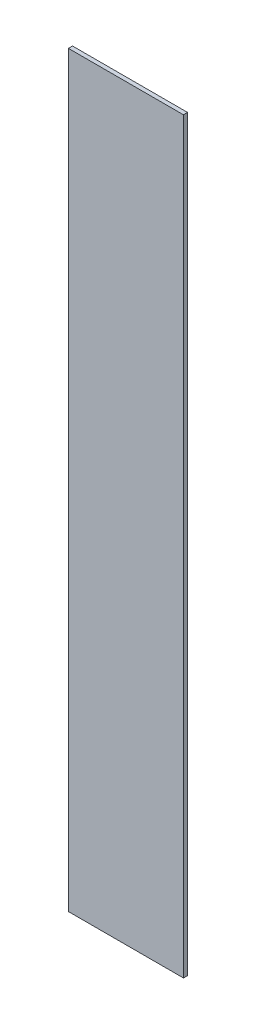
ISO-10303-21;
HEADER;
FILE_DESCRIPTION(('STEP AP214'),'2;1');
FILE_NAME('part.step','',(''),(''),'','','');
FILE_SCHEMA(('AUTOMOTIVE_DESIGN { 1 0 10303 214 1 1 1 1 }'));
ENDSEC;
DATA;
#1=APPLICATION_CONTEXT('core data for automotive mechanical design processes');
#2=APPLICATION_PROTOCOL_DEFINITION('international standard','automotive_design',2000,#1);
#3=PRODUCT_CONTEXT('',#1,'mechanical');
#4=PRODUCT('Part','Part','',(#3));
#5=PRODUCT_RELATED_PRODUCT_CATEGORY('part','',(#4));
#6=PRODUCT_DEFINITION_FORMATION('','',#4);
#7=PRODUCT_DEFINITION_CONTEXT('part definition',#1,'design');
#8=PRODUCT_DEFINITION('design','',#6,#7);
#9=PRODUCT_DEFINITION_SHAPE('','',#8);
#10=(LENGTH_UNIT() NAMED_UNIT(*) SI_UNIT(.MILLI.,.METRE.));
#11=(NAMED_UNIT(*) PLANE_ANGLE_UNIT() SI_UNIT($,.RADIAN.));
#12=(NAMED_UNIT(*) SI_UNIT($,.STERADIAN.) SOLID_ANGLE_UNIT());
#13=UNCERTAINTY_MEASURE_WITH_UNIT(LENGTH_MEASURE(1.E-05),#10,'distance_accuracy_value','');
#14=(GEOMETRIC_REPRESENTATION_CONTEXT(3) GLOBAL_UNCERTAINTY_ASSIGNED_CONTEXT((#13)) GLOBAL_UNIT_ASSIGNED_CONTEXT((#10,
#11,#12)) REPRESENTATION_CONTEXT('',''));
#15=CARTESIAN_POINT('',(0.,0.,0.));
#16=DIRECTION('',(0.,0.,1.));
#17=DIRECTION('',(1.,0.,0.));
#18=AXIS2_PLACEMENT_3D('',#15,#16,#17);
#19=CARTESIAN_POINT('',(623.,129.,27.));
#20=DIRECTION('',(1.,0.,0.));
#21=DIRECTION('',(0.,0.,-1.));
#22=AXIS2_PLACEMENT_3D('',#19,#20,#21);
#23=PLANE('',#22);
#24=DIRECTION('',(0.,-1.,0.));
#25=VECTOR('',#24,1.);
#26=CARTESIAN_POINT('',(623.,129.,26.));
#27=LINE('',#26,#25);
#28=CARTESIAN_POINT('',(623.,311.,26.));
#29=VERTEX_POINT('',#28);
#30=CARTESIAN_POINT('',(623.,129.,26.));
#31=VERTEX_POINT('',#30);
#32=EDGE_CURVE('E102',#29,#31,#27,.T.);
#33=ORIENTED_EDGE('',*,*,#32,.T.);
#34=DIRECTION('',(0.,0.,-1.));
#35=VECTOR('',#34,1.);
#36=CARTESIAN_POINT('',(623.,129.,27.));
#37=LINE('',#36,#35);
#38=CARTESIAN_POINT('',(623.,129.,27.));
#39=VERTEX_POINT('',#38);
#40=EDGE_CURVE('E11',#39,#31,#37,.T.);
#41=ORIENTED_EDGE('',*,*,#40,.F.);
#42=DIRECTION('',(0.,-1.,0.));
#43=VECTOR('',#42,1.);
#44=CARTESIAN_POINT('',(623.,129.,27.));
#45=LINE('',#44,#43);
#46=CARTESIAN_POINT('',(623.,311.,27.));
#47=VERTEX_POINT('',#46);
#48=EDGE_CURVE('E90',#47,#39,#45,.T.);
#49=ORIENTED_EDGE('',*,*,#48,.F.);
#50=DIRECTION('',(0.,0.,-1.));
#51=VECTOR('',#50,1.);
#52=CARTESIAN_POINT('',(623.,311.,27.));
#53=LINE('',#52,#51);
#54=EDGE_CURVE('E98',#47,#29,#53,.T.);
#55=ORIENTED_EDGE('',*,*,#54,.T.);
#56=EDGE_LOOP('',(#33,#41,#49,#55));
#57=FACE_BOUND('',#56,.T.);
#58=ADVANCED_FACE('F39',(#57),#23,.F.);
#59=CARTESIAN_POINT('',(623.,129.,27.));
#60=DIRECTION('',(0.,1.,0.));
#61=DIRECTION('',(0.,0.,1.));
#62=AXIS2_PLACEMENT_3D('',#59,#60,#61);
#63=PLANE('',#62);
#64=DIRECTION('',(1.,0.,0.));
#65=VECTOR('',#64,1.);
#66=CARTESIAN_POINT('',(623.,129.,26.));
#67=LINE('',#66,#65);
#68=CARTESIAN_POINT('',(651.,129.,26.));
#69=VERTEX_POINT('',#68);
#70=EDGE_CURVE('E94',#31,#69,#67,.T.);
#71=ORIENTED_EDGE('',*,*,#70,.T.);
#72=DIRECTION('',(0.,0.,-1.));
#73=VECTOR('',#72,1.);
#74=CARTESIAN_POINT('',(651.,129.,27.));
#75=LINE('',#74,#73);
#76=CARTESIAN_POINT('',(651.,129.,27.));
#77=VERTEX_POINT('',#76);
#78=EDGE_CURVE('E47',#77,#69,#75,.T.);
#79=ORIENTED_EDGE('',*,*,#78,.F.);
#80=DIRECTION('',(1.,0.,0.));
#81=VECTOR('',#80,1.);
#82=CARTESIAN_POINT('',(623.,129.,27.));
#83=LINE('',#82,#81);
#84=EDGE_CURVE('E85',#39,#77,#83,.T.);
#85=ORIENTED_EDGE('',*,*,#84,.F.);
#86=ORIENTED_EDGE('',*,*,#40,.T.);
#87=EDGE_LOOP('',(#71,#79,#85,#86));
#88=FACE_BOUND('',#87,.T.);
#89=ADVANCED_FACE('F93',(#88),#63,.F.);
#90=CARTESIAN_POINT('',(651.,129.,27.));
#91=DIRECTION('',(-1.,0.,0.));
#92=DIRECTION('',(0.,0.,1.));
#93=AXIS2_PLACEMENT_3D('',#90,#91,#92);
#94=PLANE('',#93);
#95=DIRECTION('',(0.,1.,0.));
#96=VECTOR('',#95,1.);
#97=CARTESIAN_POINT('',(651.,129.,26.));
#98=LINE('',#97,#96);
#99=CARTESIAN_POINT('',(651.,311.,26.));
#100=VERTEX_POINT('',#99);
#101=EDGE_CURVE('E72',#69,#100,#98,.T.);
#102=ORIENTED_EDGE('',*,*,#101,.T.);
#103=DIRECTION('',(0.,0.,-1.));
#104=VECTOR('',#103,1.);
#105=CARTESIAN_POINT('',(651.,311.,27.));
#106=LINE('',#105,#104);
#107=CARTESIAN_POINT('',(651.,311.,27.));
#108=VERTEX_POINT('',#107);
#109=EDGE_CURVE('E95',#108,#100,#106,.T.);
#110=ORIENTED_EDGE('',*,*,#109,.F.);
#111=DIRECTION('',(0.,1.,0.));
#112=VECTOR('',#111,1.);
#113=CARTESIAN_POINT('',(651.,129.,27.));
#114=LINE('',#113,#112);
#115=EDGE_CURVE('E88',#77,#108,#114,.T.);
#116=ORIENTED_EDGE('',*,*,#115,.F.);
#117=ORIENTED_EDGE('',*,*,#78,.T.);
#118=EDGE_LOOP('',(#102,#110,#116,#117));
#119=FACE_BOUND('',#118,.T.);
#120=ADVANCED_FACE('F96',(#119),#94,.F.);
#121=CARTESIAN_POINT('',(623.,311.,27.));
#122=DIRECTION('',(0.,-1.,0.));
#123=DIRECTION('',(0.,0.,-1.));
#124=AXIS2_PLACEMENT_3D('',#121,#122,#123);
#125=PLANE('',#124);
#126=DIRECTION('',(-1.,0.,0.));
#127=VECTOR('',#126,1.);
#128=CARTESIAN_POINT('',(623.,311.,26.));
#129=LINE('',#128,#127);
#130=EDGE_CURVE('E78',#100,#29,#129,.T.);
#131=ORIENTED_EDGE('',*,*,#130,.T.);
#132=ORIENTED_EDGE('',*,*,#54,.F.);
#133=DIRECTION('',(-1.,0.,0.));
#134=VECTOR('',#133,1.);
#135=CARTESIAN_POINT('',(623.,311.,27.));
#136=LINE('',#135,#134);
#137=EDGE_CURVE('E55',#108,#47,#136,.T.);
#138=ORIENTED_EDGE('',*,*,#137,.F.);
#139=ORIENTED_EDGE('',*,*,#109,.T.);
#140=EDGE_LOOP('',(#131,#132,#138,#139));
#141=FACE_BOUND('',#140,.T.);
#142=ADVANCED_FACE('F109',(#141),#125,.F.);
#143=CARTESIAN_POINT('',(0.,0.,27.));
#144=DIRECTION('',(0.,0.,-1.));
#145=DIRECTION('',(-1.,0.,0.));
#146=AXIS2_PLACEMENT_3D('',#143,#144,#145);
#147=PLANE('',#146);
#148=ORIENTED_EDGE('',*,*,#48,.T.);
#149=ORIENTED_EDGE('',*,*,#84,.T.);
#150=ORIENTED_EDGE('',*,*,#115,.T.);
#151=ORIENTED_EDGE('',*,*,#137,.T.);
#152=EDGE_LOOP('',(#148,#149,#150,#151));
#153=FACE_BOUND('',#152,.T.);
#154=ADVANCED_FACE('F86',(#153),#147,.F.);
#155=CARTESIAN_POINT('',(0.,0.,26.));
#156=DIRECTION('',(0.,0.,-1.));
#157=DIRECTION('',(-1.,0.,0.));
#158=AXIS2_PLACEMENT_3D('',#155,#156,#157);
#159=PLANE('',#158);
#160=ORIENTED_EDGE('',*,*,#32,.F.);
#161=ORIENTED_EDGE('',*,*,#130,.F.);
#162=ORIENTED_EDGE('',*,*,#101,.F.);
#163=ORIENTED_EDGE('',*,*,#70,.F.);
#164=EDGE_LOOP('',(#160,#161,#162,#163));
#165=FACE_BOUND('',#164,.T.);
#166=ADVANCED_FACE('F112',(#165),#159,.T.);
#167=CLOSED_SHELL('',(#58,#89,#120,#142,#154,#166));
#168=MANIFOLD_SOLID_BREP('B2',#167);
#169=ADVANCED_BREP_SHAPE_REPRESENTATION('',(#18,#168),#14);
#170=SHAPE_DEFINITION_REPRESENTATION(#9,#169);
ENDSEC;
END-ISO-10303-21;
